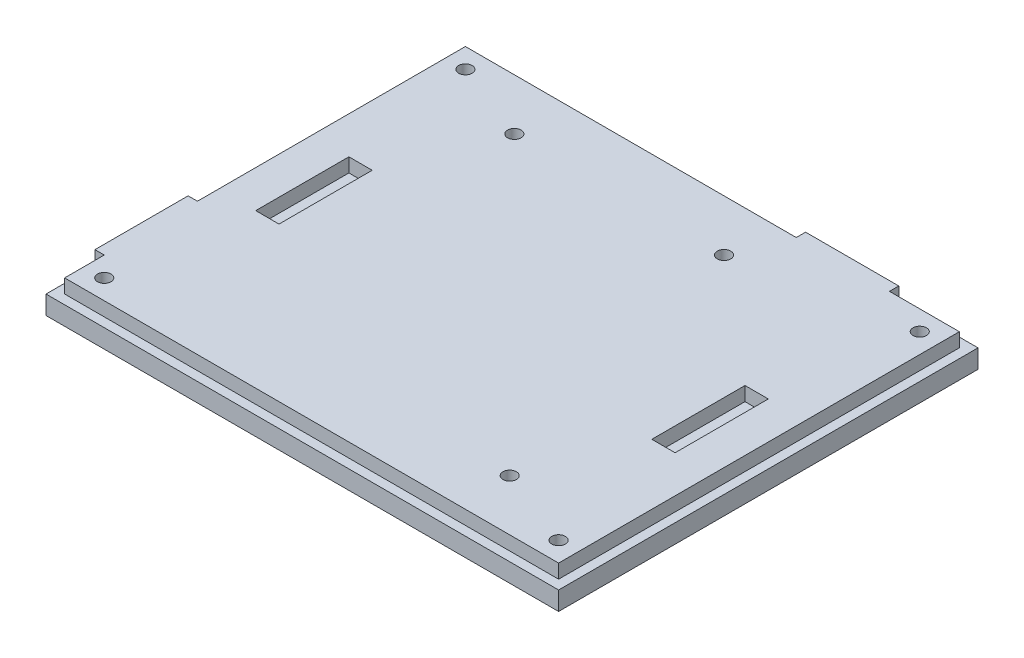
ISO-10303-21;
HEADER;
FILE_DESCRIPTION(('STEP AP214'),'2;1');
FILE_NAME('part.step','',(''),(''),'','','');
FILE_SCHEMA(('AUTOMOTIVE_DESIGN { 1 0 10303 214 1 1 1 1 }'));
ENDSEC;
DATA;
#1=APPLICATION_CONTEXT('core data for automotive mechanical design processes');
#2=APPLICATION_PROTOCOL_DEFINITION('international standard','automotive_design',2000,#1);
#3=PRODUCT_CONTEXT('',#1,'mechanical');
#4=PRODUCT('Part','Part','',(#3));
#5=PRODUCT_RELATED_PRODUCT_CATEGORY('part','',(#4));
#6=PRODUCT_DEFINITION_FORMATION('','',#4);
#7=PRODUCT_DEFINITION_CONTEXT('part definition',#1,'design');
#8=PRODUCT_DEFINITION('design','',#6,#7);
#9=PRODUCT_DEFINITION_SHAPE('','',#8);
#10=(LENGTH_UNIT() NAMED_UNIT(*) SI_UNIT(.MILLI.,.METRE.));
#11=(NAMED_UNIT(*) PLANE_ANGLE_UNIT() SI_UNIT($,.RADIAN.));
#12=(NAMED_UNIT(*) SI_UNIT($,.STERADIAN.) SOLID_ANGLE_UNIT());
#13=UNCERTAINTY_MEASURE_WITH_UNIT(LENGTH_MEASURE(1.E-05),#10,'distance_accuracy_value','');
#14=(GEOMETRIC_REPRESENTATION_CONTEXT(3) GLOBAL_UNCERTAINTY_ASSIGNED_CONTEXT((#13)) GLOBAL_UNIT_ASSIGNED_CONTEXT((#10,
#11,#12)) REPRESENTATION_CONTEXT('',''));
#15=CARTESIAN_POINT('',(0.,0.,0.));
#16=DIRECTION('',(0.,0.,1.));
#17=DIRECTION('',(1.,0.,0.));
#18=AXIS2_PLACEMENT_3D('',#15,#16,#17);
#19=CARTESIAN_POINT('',(-55.,7.,45.));
#20=DIRECTION('',(0.,0.,-1.));
#21=DIRECTION('',(-1.,0.,0.));
#22=AXIS2_PLACEMENT_3D('',#19,#20,#21);
#23=PLANE('',#22);
#24=DIRECTION('',(0.,-1.,0.));
#25=VECTOR('',#24,1.);
#26=CARTESIAN_POINT('',(55.,7.,45.));
#27=LINE('',#26,#25);
#28=CARTESIAN_POINT('',(55.,4.,45.));
#29=VERTEX_POINT('',#28);
#30=CARTESIAN_POINT('',(55.,0.,45.));
#31=VERTEX_POINT('',#30);
#32=EDGE_CURVE('E48',#29,#31,#27,.T.);
#33=ORIENTED_EDGE('',*,*,#32,.F.);
#34=DIRECTION('',(1.,0.,0.));
#35=VECTOR('',#34,1.);
#36=CARTESIAN_POINT('',(-55.,4.,45.));
#37=LINE('',#36,#35);
#38=CARTESIAN_POINT('',(-55.,4.,45.));
#39=VERTEX_POINT('',#38);
#40=EDGE_CURVE('E328',#39,#29,#37,.T.);
#41=ORIENTED_EDGE('',*,*,#40,.F.);
#42=DIRECTION('',(0.,-1.,0.));
#43=VECTOR('',#42,1.);
#44=CARTESIAN_POINT('',(-55.,7.,45.));
#45=LINE('',#44,#43);
#46=CARTESIAN_POINT('',(-55.,0.,45.));
#47=VERTEX_POINT('',#46);
#48=EDGE_CURVE('E11',#39,#47,#45,.T.);
#49=ORIENTED_EDGE('',*,*,#48,.T.);
#50=DIRECTION('',(1.,0.,0.));
#51=VECTOR('',#50,1.);
#52=CARTESIAN_POINT('',(-55.,0.,45.));
#53=LINE('',#52,#51);
#54=EDGE_CURVE('E475',#47,#31,#53,.T.);
#55=ORIENTED_EDGE('',*,*,#54,.T.);
#56=EDGE_LOOP('',(#33,#41,#49,#55));
#57=FACE_BOUND('',#56,.T.);
#58=ADVANCED_FACE('F39',(#57),#23,.F.);
#59=CARTESIAN_POINT('',(-55.,7.,-45.));
#60=DIRECTION('',(1.,0.,0.));
#61=DIRECTION('',(0.,0.,-1.));
#62=AXIS2_PLACEMENT_3D('',#59,#60,#61);
#63=PLANE('',#62);
#64=DIRECTION('',(0.,0.,1.));
#65=VECTOR('',#64,1.);
#66=CARTESIAN_POINT('',(-55.,7.,-45.));
#67=LINE('',#66,#65);
#68=CARTESIAN_POINT('',(-55.,7.,14.5));
#69=VERTEX_POINT('',#68);
#70=CARTESIAN_POINT('',(-55.,7.,34.5));
#71=VERTEX_POINT('',#70);
#72=EDGE_CURVE('E462',#69,#71,#67,.T.);
#73=ORIENTED_EDGE('',*,*,#72,.F.);
#74=DIRECTION('',(0.,1.,0.));
#75=VECTOR('',#74,1.);
#76=CARTESIAN_POINT('',(-55.,4.,14.5));
#77=LINE('',#76,#75);
#78=CARTESIAN_POINT('',(-55.,4.,14.5));
#79=VERTEX_POINT('',#78);
#80=EDGE_CURVE('E63',#79,#69,#77,.T.);
#81=ORIENTED_EDGE('',*,*,#80,.F.);
#82=DIRECTION('',(0.,0.,1.));
#83=VECTOR('',#82,1.);
#84=CARTESIAN_POINT('',(-55.,4.,-45.));
#85=LINE('',#84,#83);
#86=CARTESIAN_POINT('',(-55.,4.,-45.));
#87=VERTEX_POINT('',#86);
#88=EDGE_CURVE('E296',#87,#79,#85,.T.);
#89=ORIENTED_EDGE('',*,*,#88,.F.);
#90=DIRECTION('',(0.,-1.,0.));
#91=VECTOR('',#90,1.);
#92=CARTESIAN_POINT('',(-55.,7.,-45.));
#93=LINE('',#92,#91);
#94=CARTESIAN_POINT('',(-55.,0.,-45.));
#95=VERTEX_POINT('',#94);
#96=EDGE_CURVE('E471',#87,#95,#93,.T.);
#97=ORIENTED_EDGE('',*,*,#96,.T.);
#98=DIRECTION('',(0.,0.,1.));
#99=VECTOR('',#98,1.);
#100=CARTESIAN_POINT('',(-55.,0.,-45.));
#101=LINE('',#100,#99);
#102=EDGE_CURVE('E461',#95,#47,#101,.T.);
#103=ORIENTED_EDGE('',*,*,#102,.T.);
#104=ORIENTED_EDGE('',*,*,#48,.F.);
#105=DIRECTION('',(0.,0.,1.));
#106=VECTOR('',#105,1.);
#107=CARTESIAN_POINT('',(-55.,4.,45.));
#108=LINE('',#107,#106);
#109=CARTESIAN_POINT('',(-55.,4.,34.5));
#110=VERTEX_POINT('',#109);
#111=EDGE_CURVE('E325',#110,#39,#108,.T.);
#112=ORIENTED_EDGE('',*,*,#111,.F.);
#113=DIRECTION('',(0.,1.,0.));
#114=VECTOR('',#113,1.);
#115=CARTESIAN_POINT('',(-55.,4.,34.5));
#116=LINE('',#115,#114);
#117=EDGE_CURVE('E315',#110,#71,#116,.T.);
#118=ORIENTED_EDGE('',*,*,#117,.T.);
#119=EDGE_LOOP('',(#73,#81,#89,#97,#103,#104,#112,#118));
#120=FACE_BOUND('',#119,.T.);
#121=ADVANCED_FACE('F41',(#120),#63,.F.);
#122=CARTESIAN_POINT('',(55.,7.,-45.));
#123=DIRECTION('',(-1.,0.,0.));
#124=DIRECTION('',(0.,0.,1.));
#125=AXIS2_PLACEMENT_3D('',#122,#123,#124);
#126=PLANE('',#125);
#127=DIRECTION('',(0.,0.,-1.));
#128=VECTOR('',#127,1.);
#129=CARTESIAN_POINT('',(55.,4.,-45.));
#130=LINE('',#129,#128);
#131=CARTESIAN_POINT('',(55.,4.,-45.));
#132=VERTEX_POINT('',#131);
#133=EDGE_CURVE('E274',#29,#132,#130,.T.);
#134=ORIENTED_EDGE('',*,*,#133,.F.);
#135=ORIENTED_EDGE('',*,*,#32,.T.);
#136=DIRECTION('',(0.,0.,-1.));
#137=VECTOR('',#136,1.);
#138=CARTESIAN_POINT('',(55.,0.,-45.));
#139=LINE('',#138,#137);
#140=CARTESIAN_POINT('',(55.,0.,-45.));
#141=VERTEX_POINT('',#140);
#142=EDGE_CURVE('E479',#31,#141,#139,.T.);
#143=ORIENTED_EDGE('',*,*,#142,.T.);
#144=DIRECTION('',(0.,-1.,0.));
#145=VECTOR('',#144,1.);
#146=CARTESIAN_POINT('',(55.,7.,-45.));
#147=LINE('',#146,#145);
#148=EDGE_CURVE('E488',#132,#141,#147,.T.);
#149=ORIENTED_EDGE('',*,*,#148,.F.);
#150=EDGE_LOOP('',(#134,#135,#143,#149));
#151=FACE_BOUND('',#150,.T.);
#152=ADVANCED_FACE('F494',(#151),#126,.F.);
#153=CARTESIAN_POINT('',(-55.,7.,-45.));
#154=DIRECTION('',(0.,0.,1.));
#155=DIRECTION('',(1.,0.,0.));
#156=AXIS2_PLACEMENT_3D('',#153,#154,#155);
#157=PLANE('',#156);
#158=DIRECTION('',(-1.,0.,0.));
#159=VECTOR('',#158,1.);
#160=CARTESIAN_POINT('',(-55.,4.,-45.));
#161=LINE('',#160,#159);
#162=CARTESIAN_POINT('',(18.,4.,-45.));
#163=VERTEX_POINT('',#162);
#164=EDGE_CURVE('E309',#163,#87,#161,.T.);
#165=ORIENTED_EDGE('',*,*,#164,.F.);
#166=DIRECTION('',(0.,1.,0.));
#167=VECTOR('',#166,1.);
#168=CARTESIAN_POINT('',(18.,4.,-45.));
#169=LINE('',#168,#167);
#170=CARTESIAN_POINT('',(18.,7.,-45.));
#171=VERTEX_POINT('',#170);
#172=EDGE_CURVE('E264',#163,#171,#169,.T.);
#173=ORIENTED_EDGE('',*,*,#172,.T.);
#174=DIRECTION('',(-1.,0.,0.));
#175=VECTOR('',#174,1.);
#176=CARTESIAN_POINT('',(-55.,7.,-45.));
#177=LINE('',#176,#175);
#178=CARTESIAN_POINT('',(38.,7.,-45.));
#179=VERTEX_POINT('',#178);
#180=EDGE_CURVE('E466',#179,#171,#177,.T.);
#181=ORIENTED_EDGE('',*,*,#180,.F.);
#182=DIRECTION('',(0.,1.,0.));
#183=VECTOR('',#182,1.);
#184=CARTESIAN_POINT('',(38.,4.,-45.));
#185=LINE('',#184,#183);
#186=CARTESIAN_POINT('',(38.,4.,-45.));
#187=VERTEX_POINT('',#186);
#188=EDGE_CURVE('E55',#187,#179,#185,.T.);
#189=ORIENTED_EDGE('',*,*,#188,.F.);
#190=DIRECTION('',(-1.,0.,0.));
#191=VECTOR('',#190,1.);
#192=CARTESIAN_POINT('',(55.,4.,-45.));
#193=LINE('',#192,#191);
#194=EDGE_CURVE('E277',#132,#187,#193,.T.);
#195=ORIENTED_EDGE('',*,*,#194,.F.);
#196=ORIENTED_EDGE('',*,*,#148,.T.);
#197=DIRECTION('',(-1.,0.,0.));
#198=VECTOR('',#197,1.);
#199=CARTESIAN_POINT('',(-55.,0.,-45.));
#200=LINE('',#199,#198);
#201=EDGE_CURVE('E467',#141,#95,#200,.T.);
#202=ORIENTED_EDGE('',*,*,#201,.T.);
#203=ORIENTED_EDGE('',*,*,#96,.F.);
#204=EDGE_LOOP('',(#165,#173,#181,#189,#195,#196,#202,#203));
#205=FACE_BOUND('',#204,.T.);
#206=ADVANCED_FACE('F507',(#205),#157,.F.);
#207=CARTESIAN_POINT('',(0.,7.,0.));
#208=DIRECTION('',(0.,1.,0.));
#209=DIRECTION('',(0.,0.,1.));
#210=AXIS2_PLACEMENT_3D('',#207,#208,#209);
#211=PLANE('',#210);
#212=CARTESIAN_POINT('',(48.75,7.,-38.75));
#213=DIRECTION('',(0.,1.,0.));
#214=DIRECTION('',(0.,0.,1.));
#215=AXIS2_PLACEMENT_3D('',#212,#213,#214);
#216=CIRCLE('',#215,1.44999999999999);
#217=CARTESIAN_POINT('',(48.75,7.,-37.3));
#218=VERTEX_POINT('',#217);
#219=EDGE_CURVE('E685',#218,#218,#216,.T.);
#220=ORIENTED_EDGE('',*,*,#219,.F.);
#221=EDGE_LOOP('',(#220));
#222=FACE_BOUND('',#221,.T.);
#223=CARTESIAN_POINT('',(-48.75,7.,-38.75));
#224=DIRECTION('',(0.,1.,0.));
#225=DIRECTION('',(0.,0.,1.));
#226=AXIS2_PLACEMENT_3D('',#223,#224,#225);
#227=CIRCLE('',#226,1.44999999999999);
#228=CARTESIAN_POINT('',(-48.75,7.,-37.3));
#229=VERTEX_POINT('',#228);
#230=EDGE_CURVE('E689',#229,#229,#227,.T.);
#231=ORIENTED_EDGE('',*,*,#230,.F.);
#232=EDGE_LOOP('',(#231));
#233=FACE_BOUND('',#232,.T.);
#234=CARTESIAN_POINT('',(48.75,7.,38.75));
#235=DIRECTION('',(0.,1.,0.));
#236=DIRECTION('',(0.,0.,1.));
#237=AXIS2_PLACEMENT_3D('',#234,#235,#236);
#238=CIRCLE('',#237,1.44999999999999);
#239=CARTESIAN_POINT('',(48.75,7.,40.2));
#240=VERTEX_POINT('',#239);
#241=EDGE_CURVE('E699',#240,#240,#238,.T.);
#242=ORIENTED_EDGE('',*,*,#241,.F.);
#243=EDGE_LOOP('',(#242));
#244=FACE_BOUND('',#243,.T.);
#245=CARTESIAN_POINT('',(-48.75,7.,38.75));
#246=DIRECTION('',(0.,1.,0.));
#247=DIRECTION('',(0.,0.,1.));
#248=AXIS2_PLACEMENT_3D('',#245,#246,#247);
#249=CIRCLE('',#248,1.44999999999999);
#250=CARTESIAN_POINT('',(-48.75,7.,40.2));
#251=VERTEX_POINT('',#250);
#252=EDGE_CURVE('E537',#251,#251,#249,.T.);
#253=ORIENTED_EDGE('',*,*,#252,.F.);
#254=EDGE_LOOP('',(#253));
#255=FACE_BOUND('',#254,.T.);
#256=DIRECTION('',(-1.,0.,0.));
#257=VECTOR('',#256,1.);
#258=CARTESIAN_POINT('',(53.,7.,43.));
#259=LINE('',#258,#257);
#260=CARTESIAN_POINT('',(53.,7.,43.));
#261=VERTEX_POINT('',#260);
#262=CARTESIAN_POINT('',(-53.,7.,43.));
#263=VERTEX_POINT('',#262);
#264=EDGE_CURVE('E221',#261,#263,#259,.T.);
#265=ORIENTED_EDGE('',*,*,#264,.F.);
#266=DIRECTION('',(0.,0.,1.));
#267=VECTOR('',#266,1.);
#268=CARTESIAN_POINT('',(53.,7.,-43.));
#269=LINE('',#268,#267);
#270=CARTESIAN_POINT('',(53.,7.,-43.));
#271=VERTEX_POINT('',#270);
#272=EDGE_CURVE('E229',#271,#261,#269,.T.);
#273=ORIENTED_EDGE('',*,*,#272,.F.);
#274=DIRECTION('',(1.,0.,0.));
#275=VECTOR('',#274,1.);
#276=CARTESIAN_POINT('',(55.,7.,-43.));
#277=LINE('',#276,#275);
#278=CARTESIAN_POINT('',(38.,7.,-43.));
#279=VERTEX_POINT('',#278);
#280=EDGE_CURVE('E278',#279,#271,#277,.T.);
#281=ORIENTED_EDGE('',*,*,#280,.F.);
#282=DIRECTION('',(0.,0.,1.));
#283=VECTOR('',#282,1.);
#284=CARTESIAN_POINT('',(38.,7.,-45.));
#285=LINE('',#284,#283);
#286=EDGE_CURVE('E242',#179,#279,#285,.T.);
#287=ORIENTED_EDGE('',*,*,#286,.F.);
#288=ORIENTED_EDGE('',*,*,#180,.T.);
#289=DIRECTION('',(0.,0.,-1.));
#290=VECTOR('',#289,1.);
#291=CARTESIAN_POINT('',(18.,7.,-45.));
#292=LINE('',#291,#290);
#293=CARTESIAN_POINT('',(18.,7.,-43.));
#294=VERTEX_POINT('',#293);
#295=EDGE_CURVE('E252',#294,#171,#292,.T.);
#296=ORIENTED_EDGE('',*,*,#295,.F.);
#297=DIRECTION('',(1.,0.,0.));
#298=VECTOR('',#297,1.);
#299=CARTESIAN_POINT('',(-53.,7.,-43.));
#300=LINE('',#299,#298);
#301=CARTESIAN_POINT('',(-53.,7.,-43.));
#302=VERTEX_POINT('',#301);
#303=EDGE_CURVE('E257',#302,#294,#300,.T.);
#304=ORIENTED_EDGE('',*,*,#303,.F.);
#305=DIRECTION('',(0.,0.,-1.));
#306=VECTOR('',#305,1.);
#307=CARTESIAN_POINT('',(-53.,7.,-45.));
#308=LINE('',#307,#306);
#309=CARTESIAN_POINT('',(-53.,7.,14.5));
#310=VERTEX_POINT('',#309);
#311=EDGE_CURVE('E301',#310,#302,#308,.T.);
#312=ORIENTED_EDGE('',*,*,#311,.F.);
#313=DIRECTION('',(1.,0.,0.));
#314=VECTOR('',#313,1.);
#315=CARTESIAN_POINT('',(-55.,7.,14.5));
#316=LINE('',#315,#314);
#317=EDGE_CURVE('E312',#69,#310,#316,.T.);
#318=ORIENTED_EDGE('',*,*,#317,.F.);
#319=ORIENTED_EDGE('',*,*,#72,.T.);
#320=DIRECTION('',(-1.,0.,0.));
#321=VECTOR('',#320,1.);
#322=CARTESIAN_POINT('',(-55.,7.,34.5));
#323=LINE('',#322,#321);
#324=CARTESIAN_POINT('',(-53.,7.,34.5));
#325=VERTEX_POINT('',#324);
#326=EDGE_CURVE('E329',#325,#71,#323,.T.);
#327=ORIENTED_EDGE('',*,*,#326,.F.);
#328=DIRECTION('',(0.,0.,-1.));
#329=VECTOR('',#328,1.);
#330=CARTESIAN_POINT('',(-53.,7.,45.));
#331=LINE('',#330,#329);
#332=EDGE_CURVE('E268',#263,#325,#331,.T.);
#333=ORIENTED_EDGE('',*,*,#332,.F.);
#334=EDGE_LOOP('',(#265,#273,#281,#287,#288,#296,#304,#312,#318,#319,#327,#333));
#335=FACE_BOUND('',#334,.T.);
#336=DIRECTION('',(0.,0.,1.));
#337=VECTOR('',#336,1.);
#338=CARTESIAN_POINT('',(-45.,7.,-10.));
#339=LINE('',#338,#337);
#340=CARTESIAN_POINT('',(-45.,7.,-10.));
#341=VERTEX_POINT('',#340);
#342=CARTESIAN_POINT('',(-45.,7.,10.));
#343=VERTEX_POINT('',#342);
#344=EDGE_CURVE('E368',#341,#343,#339,.T.);
#345=ORIENTED_EDGE('',*,*,#344,.F.);
#346=DIRECTION('',(-1.,0.,0.));
#347=VECTOR('',#346,1.);
#348=CARTESIAN_POINT('',(-45.,7.,-10.));
#349=LINE('',#348,#347);
#350=CARTESIAN_POINT('',(-40.,7.,-10.));
#351=VERTEX_POINT('',#350);
#352=EDGE_CURVE('E355',#351,#341,#349,.T.);
#353=ORIENTED_EDGE('',*,*,#352,.F.);
#354=DIRECTION('',(0.,0.,-1.));
#355=VECTOR('',#354,1.);
#356=CARTESIAN_POINT('',(-40.,7.,-10.));
#357=LINE('',#356,#355);
#358=CARTESIAN_POINT('',(-40.,7.,10.));
#359=VERTEX_POINT('',#358);
#360=EDGE_CURVE('E376',#359,#351,#357,.T.);
#361=ORIENTED_EDGE('',*,*,#360,.F.);
#362=DIRECTION('',(1.,0.,0.));
#363=VECTOR('',#362,1.);
#364=CARTESIAN_POINT('',(-45.,7.,10.));
#365=LINE('',#364,#363);
#366=EDGE_CURVE('E371',#343,#359,#365,.T.);
#367=ORIENTED_EDGE('',*,*,#366,.F.);
#368=EDGE_LOOP('',(#345,#353,#361,#367));
#369=FACE_BOUND('',#368,.T.);
#370=DIRECTION('',(0.,0.,-1.));
#371=VECTOR('',#370,1.);
#372=CARTESIAN_POINT('',(45.,7.,-10.));
#373=LINE('',#372,#371);
#374=CARTESIAN_POINT('',(45.,7.,10.));
#375=VERTEX_POINT('',#374);
#376=CARTESIAN_POINT('',(45.,7.,-10.));
#377=VERTEX_POINT('',#376);
#378=EDGE_CURVE('E322',#375,#377,#373,.T.);
#379=ORIENTED_EDGE('',*,*,#378,.F.);
#380=DIRECTION('',(1.,0.,0.));
#381=VECTOR('',#380,1.);
#382=CARTESIAN_POINT('',(45.,7.,10.));
#383=LINE('',#382,#381);
#384=CARTESIAN_POINT('',(40.,7.,10.));
#385=VERTEX_POINT('',#384);
#386=EDGE_CURVE('E401',#385,#375,#383,.T.);
#387=ORIENTED_EDGE('',*,*,#386,.F.);
#388=DIRECTION('',(0.,0.,1.));
#389=VECTOR('',#388,1.);
#390=CARTESIAN_POINT('',(40.,7.,-10.));
#391=LINE('',#390,#389);
#392=CARTESIAN_POINT('',(40.,7.,-10.));
#393=VERTEX_POINT('',#392);
#394=EDGE_CURVE('E420',#393,#385,#391,.T.);
#395=ORIENTED_EDGE('',*,*,#394,.F.);
#396=DIRECTION('',(-1.,0.,0.));
#397=VECTOR('',#396,1.);
#398=CARTESIAN_POINT('',(45.,7.,-10.));
#399=LINE('',#398,#397);
#400=EDGE_CURVE('E416',#377,#393,#399,.T.);
#401=ORIENTED_EDGE('',*,*,#400,.F.);
#402=EDGE_LOOP('',(#379,#387,#395,#401));
#403=FACE_BOUND('',#402,.T.);
#404=CARTESIAN_POINT('',(-31.5,7.,-32.));
#405=DIRECTION('',(0.,1.,0.));
#406=DIRECTION('',(0.,0.,1.));
#407=AXIS2_PLACEMENT_3D('',#404,#405,#406);
#408=CIRCLE('',#407,1.44999999999999);
#409=CARTESIAN_POINT('',(-31.5,7.,-30.55));
#410=VERTEX_POINT('',#409);
#411=EDGE_CURVE('E386',#410,#410,#408,.T.);
#412=ORIENTED_EDGE('',*,*,#411,.F.);
#413=EDGE_LOOP('',(#412));
#414=FACE_BOUND('',#413,.T.);
#415=CARTESIAN_POINT('',(13.5,7.,-32.));
#416=DIRECTION('',(0.,1.,0.));
#417=DIRECTION('',(0.,0.,1.));
#418=AXIS2_PLACEMENT_3D('',#415,#416,#417);
#419=CIRCLE('',#418,1.44999999999999);
#420=CARTESIAN_POINT('',(13.5,7.,-30.55));
#421=VERTEX_POINT('',#420);
#422=EDGE_CURVE('E445',#421,#421,#419,.T.);
#423=ORIENTED_EDGE('',*,*,#422,.F.);
#424=EDGE_LOOP('',(#423));
#425=FACE_BOUND('',#424,.T.);
#426=CARTESIAN_POINT('',(31.5,7.,32.));
#427=DIRECTION('',(0.,1.,0.));
#428=DIRECTION('',(0.,0.,1.));
#429=AXIS2_PLACEMENT_3D('',#426,#427,#428);
#430=CIRCLE('',#429,1.44999999999999);
#431=CARTESIAN_POINT('',(31.5,7.,33.45));
#432=VERTEX_POINT('',#431);
#433=EDGE_CURVE('E453',#432,#432,#430,.T.);
#434=ORIENTED_EDGE('',*,*,#433,.F.);
#435=EDGE_LOOP('',(#434));
#436=FACE_BOUND('',#435,.T.);
#437=ADVANCED_FACE('F523',(#222,#233,#244,#255,#335,#369,#403,#414,#425,#436),#211,.T.);
#438=CARTESIAN_POINT('',(0.,0.,0.));
#439=DIRECTION('',(0.,1.,0.));
#440=DIRECTION('',(0.,0.,1.));
#441=AXIS2_PLACEMENT_3D('',#438,#439,#440);
#442=PLANE('',#441);
#443=CARTESIAN_POINT('',(48.75,0.,-38.75));
#444=DIRECTION('',(0.,1.,0.));
#445=DIRECTION('',(0.,0.,1.));
#446=AXIS2_PLACEMENT_3D('',#443,#444,#445);
#447=CIRCLE('',#446,1.45);
#448=CARTESIAN_POINT('',(48.75,0.,-37.3));
#449=VERTEX_POINT('',#448);
#450=EDGE_CURVE('E682',#449,#449,#447,.T.);
#451=ORIENTED_EDGE('',*,*,#450,.T.);
#452=EDGE_LOOP('',(#451));
#453=FACE_BOUND('',#452,.T.);
#454=CARTESIAN_POINT('',(-48.75,0.,-38.75));
#455=DIRECTION('',(0.,1.,0.));
#456=DIRECTION('',(0.,0.,1.));
#457=AXIS2_PLACEMENT_3D('',#454,#455,#456);
#458=CIRCLE('',#457,1.45);
#459=CARTESIAN_POINT('',(-48.75,0.,-37.3));
#460=VERTEX_POINT('',#459);
#461=EDGE_CURVE('E695',#460,#460,#458,.T.);
#462=ORIENTED_EDGE('',*,*,#461,.T.);
#463=EDGE_LOOP('',(#462));
#464=FACE_BOUND('',#463,.T.);
#465=CARTESIAN_POINT('',(48.75,0.,38.75));
#466=DIRECTION('',(0.,1.,0.));
#467=DIRECTION('',(0.,0.,1.));
#468=AXIS2_PLACEMENT_3D('',#465,#466,#467);
#469=CIRCLE('',#468,1.45);
#470=CARTESIAN_POINT('',(48.75,0.,40.2));
#471=VERTEX_POINT('',#470);
#472=EDGE_CURVE('E703',#471,#471,#469,.T.);
#473=ORIENTED_EDGE('',*,*,#472,.T.);
#474=EDGE_LOOP('',(#473));
#475=FACE_BOUND('',#474,.T.);
#476=CARTESIAN_POINT('',(-48.75,0.,38.75));
#477=DIRECTION('',(0.,1.,0.));
#478=DIRECTION('',(0.,0.,1.));
#479=AXIS2_PLACEMENT_3D('',#476,#477,#478);
#480=CIRCLE('',#479,1.45);
#481=CARTESIAN_POINT('',(-48.75,0.,40.2));
#482=VERTEX_POINT('',#481);
#483=EDGE_CURVE('E533',#482,#482,#480,.T.);
#484=ORIENTED_EDGE('',*,*,#483,.T.);
#485=EDGE_LOOP('',(#484));
#486=FACE_BOUND('',#485,.T.);
#487=ORIENTED_EDGE('',*,*,#102,.F.);
#488=ORIENTED_EDGE('',*,*,#201,.F.);
#489=ORIENTED_EDGE('',*,*,#142,.F.);
#490=ORIENTED_EDGE('',*,*,#54,.F.);
#491=EDGE_LOOP('',(#487,#488,#489,#490));
#492=FACE_BOUND('',#491,.T.);
#493=ADVANCED_FACE('F504',(#453,#464,#475,#486,#492),#442,.F.);
#494=CARTESIAN_POINT('',(31.5,2.,32.));
#495=DIRECTION('',(0.,1.,0.));
#496=DIRECTION('',(0.,0.,1.));
#497=AXIS2_PLACEMENT_3D('',#494,#495,#496);
#498=CONICAL_SURFACE('',#497,1.44999999999999,1.02974425867665);
#499=CARTESIAN_POINT('',(31.5,1.12875210241004,32.));
#500=VERTEX_POINT('',#499);
#501=VERTEX_LOOP('',#500);
#502=FACE_BOUND('',#501,.T.);
#503=CARTESIAN_POINT('',(31.5,2.,32.));
#504=DIRECTION('',(0.,1.,0.));
#505=DIRECTION('',(0.,0.,1.));
#506=AXIS2_PLACEMENT_3D('',#503,#504,#505);
#507=CIRCLE('',#506,1.44999999999999);
#508=CARTESIAN_POINT('',(31.5,2.,33.45));
#509=VERTEX_POINT('',#508);
#510=EDGE_CURVE('E457',#509,#509,#507,.T.);
#511=ORIENTED_EDGE('',*,*,#510,.T.);
#512=EDGE_LOOP('',(#511));
#513=FACE_BOUND('',#512,.T.);
#514=ADVANCED_FACE('F572',(#502,#513),#498,.F.);
#515=CARTESIAN_POINT('',(31.5,7.,32.));
#516=DIRECTION('',(0.,1.,0.));
#517=DIRECTION('',(0.,0.,1.));
#518=AXIS2_PLACEMENT_3D('',#515,#516,#517);
#519=CYLINDRICAL_SURFACE('',#518,1.44999999999999);
#520=ORIENTED_EDGE('',*,*,#510,.F.);
#521=EDGE_LOOP('',(#520));
#522=FACE_BOUND('',#521,.T.);
#523=ORIENTED_EDGE('',*,*,#433,.T.);
#524=EDGE_LOOP('',(#523));
#525=FACE_BOUND('',#524,.T.);
#526=ADVANCED_FACE('F579',(#522,#525),#519,.F.);
#527=CARTESIAN_POINT('',(13.5,2.,-32.));
#528=DIRECTION('',(0.,1.,0.));
#529=DIRECTION('',(0.,0.,1.));
#530=AXIS2_PLACEMENT_3D('',#527,#528,#529);
#531=CONICAL_SURFACE('',#530,1.44999999999999,1.02974425867665);
#532=CARTESIAN_POINT('',(13.5,1.12875210241004,-32.));
#533=VERTEX_POINT('',#532);
#534=VERTEX_LOOP('',#533);
#535=FACE_BOUND('',#534,.T.);
#536=CARTESIAN_POINT('',(13.5,2.,-32.));
#537=DIRECTION('',(0.,1.,0.));
#538=DIRECTION('',(0.,0.,1.));
#539=AXIS2_PLACEMENT_3D('',#536,#537,#538);
#540=CIRCLE('',#539,1.44999999999999);
#541=CARTESIAN_POINT('',(13.5,2.,-30.55));
#542=VERTEX_POINT('',#541);
#543=EDGE_CURVE('E449',#542,#542,#540,.T.);
#544=ORIENTED_EDGE('',*,*,#543,.T.);
#545=EDGE_LOOP('',(#544));
#546=FACE_BOUND('',#545,.T.);
#547=ADVANCED_FACE('F583',(#535,#546),#531,.F.);
#548=CARTESIAN_POINT('',(13.5,7.,-32.));
#549=DIRECTION('',(0.,1.,0.));
#550=DIRECTION('',(0.,0.,1.));
#551=AXIS2_PLACEMENT_3D('',#548,#549,#550);
#552=CYLINDRICAL_SURFACE('',#551,1.44999999999999);
#553=ORIENTED_EDGE('',*,*,#543,.F.);
#554=EDGE_LOOP('',(#553));
#555=FACE_BOUND('',#554,.T.);
#556=ORIENTED_EDGE('',*,*,#422,.T.);
#557=EDGE_LOOP('',(#556));
#558=FACE_BOUND('',#557,.T.);
#559=ADVANCED_FACE('F587',(#555,#558),#552,.F.);
#560=CARTESIAN_POINT('',(-31.5,2.,-32.));
#561=DIRECTION('',(0.,1.,0.));
#562=DIRECTION('',(0.,0.,1.));
#563=AXIS2_PLACEMENT_3D('',#560,#561,#562);
#564=CONICAL_SURFACE('',#563,1.44999999999999,1.02974425867665);
#565=CARTESIAN_POINT('',(-31.5,1.12875210241004,-32.));
#566=VERTEX_POINT('',#565);
#567=VERTEX_LOOP('',#566);
#568=FACE_BOUND('',#567,.T.);
#569=CARTESIAN_POINT('',(-31.5,2.,-32.));
#570=DIRECTION('',(0.,1.,0.));
#571=DIRECTION('',(0.,0.,1.));
#572=AXIS2_PLACEMENT_3D('',#569,#570,#571);
#573=CIRCLE('',#572,1.44999999999999);
#574=CARTESIAN_POINT('',(-31.5,2.,-30.55));
#575=VERTEX_POINT('',#574);
#576=EDGE_CURVE('E441',#575,#575,#573,.T.);
#577=ORIENTED_EDGE('',*,*,#576,.T.);
#578=EDGE_LOOP('',(#577));
#579=FACE_BOUND('',#578,.T.);
#580=ADVANCED_FACE('F591',(#568,#579),#564,.F.);
#581=CARTESIAN_POINT('',(-31.5,7.,-32.));
#582=DIRECTION('',(0.,1.,0.));
#583=DIRECTION('',(0.,0.,1.));
#584=AXIS2_PLACEMENT_3D('',#581,#582,#583);
#585=CYLINDRICAL_SURFACE('',#584,1.44999999999999);
#586=ORIENTED_EDGE('',*,*,#576,.F.);
#587=EDGE_LOOP('',(#586));
#588=FACE_BOUND('',#587,.T.);
#589=ORIENTED_EDGE('',*,*,#411,.T.);
#590=EDGE_LOOP('',(#589));
#591=FACE_BOUND('',#590,.T.);
#592=ADVANCED_FACE('F595',(#588,#591),#585,.F.);
#593=CARTESIAN_POINT('',(45.,4.,-10.));
#594=DIRECTION('',(1.,0.,0.));
#595=DIRECTION('',(0.,0.,-1.));
#596=AXIS2_PLACEMENT_3D('',#593,#594,#595);
#597=PLANE('',#596);
#598=ORIENTED_EDGE('',*,*,#378,.T.);
#599=DIRECTION('',(0.,1.,0.));
#600=VECTOR('',#599,1.);
#601=CARTESIAN_POINT('',(45.,4.,-10.));
#602=LINE('',#601,#600);
#603=CARTESIAN_POINT('',(45.,4.,-10.));
#604=VERTEX_POINT('',#603);
#605=EDGE_CURVE('E413',#604,#377,#602,.T.);
#606=ORIENTED_EDGE('',*,*,#605,.F.);
#607=DIRECTION('',(0.,0.,-1.));
#608=VECTOR('',#607,1.);
#609=CARTESIAN_POINT('',(45.,4.,-10.));
#610=LINE('',#609,#608);
#611=CARTESIAN_POINT('',(45.,4.,10.));
#612=VERTEX_POINT('',#611);
#613=EDGE_CURVE('E396',#612,#604,#610,.T.);
#614=ORIENTED_EDGE('',*,*,#613,.F.);
#615=DIRECTION('',(0.,1.,0.));
#616=VECTOR('',#615,1.);
#617=CARTESIAN_POINT('',(45.,4.,10.));
#618=LINE('',#617,#616);
#619=EDGE_CURVE('E372',#612,#375,#618,.T.);
#620=ORIENTED_EDGE('',*,*,#619,.T.);
#621=EDGE_LOOP('',(#598,#606,#614,#620));
#622=FACE_BOUND('',#621,.T.);
#623=ADVANCED_FACE('F599',(#622),#597,.F.);
#624=CARTESIAN_POINT('',(45.,4.,10.));
#625=DIRECTION('',(0.,0.,1.));
#626=DIRECTION('',(1.,0.,0.));
#627=AXIS2_PLACEMENT_3D('',#624,#625,#626);
#628=PLANE('',#627);
#629=ORIENTED_EDGE('',*,*,#386,.T.);
#630=ORIENTED_EDGE('',*,*,#619,.F.);
#631=DIRECTION('',(1.,0.,0.));
#632=VECTOR('',#631,1.);
#633=CARTESIAN_POINT('',(45.,4.,10.));
#634=LINE('',#633,#632);
#635=CARTESIAN_POINT('',(40.,4.,10.));
#636=VERTEX_POINT('',#635);
#637=EDGE_CURVE('E409',#636,#612,#634,.T.);
#638=ORIENTED_EDGE('',*,*,#637,.F.);
#639=DIRECTION('',(0.,1.,0.));
#640=VECTOR('',#639,1.);
#641=CARTESIAN_POINT('',(40.,4.,10.));
#642=LINE('',#641,#640);
#643=EDGE_CURVE('E429',#636,#385,#642,.T.);
#644=ORIENTED_EDGE('',*,*,#643,.T.);
#645=EDGE_LOOP('',(#629,#630,#638,#644));
#646=FACE_BOUND('',#645,.T.);
#647=ADVANCED_FACE('F603',(#646),#628,.F.);
#648=CARTESIAN_POINT('',(40.,4.,-10.));
#649=DIRECTION('',(-1.,0.,0.));
#650=DIRECTION('',(0.,0.,1.));
#651=AXIS2_PLACEMENT_3D('',#648,#649,#650);
#652=PLANE('',#651);
#653=ORIENTED_EDGE('',*,*,#394,.T.);
#654=ORIENTED_EDGE('',*,*,#643,.F.);
#655=DIRECTION('',(0.,0.,1.));
#656=VECTOR('',#655,1.);
#657=CARTESIAN_POINT('',(40.,4.,-10.));
#658=LINE('',#657,#656);
#659=CARTESIAN_POINT('',(40.,4.,-10.));
#660=VERTEX_POINT('',#659);
#661=EDGE_CURVE('E405',#660,#636,#658,.T.);
#662=ORIENTED_EDGE('',*,*,#661,.F.);
#663=DIRECTION('',(0.,1.,0.));
#664=VECTOR('',#663,1.);
#665=CARTESIAN_POINT('',(40.,4.,-10.));
#666=LINE('',#665,#664);
#667=EDGE_CURVE('E432',#660,#393,#666,.T.);
#668=ORIENTED_EDGE('',*,*,#667,.T.);
#669=EDGE_LOOP('',(#653,#654,#662,#668));
#670=FACE_BOUND('',#669,.T.);
#671=ADVANCED_FACE('F609',(#670),#652,.F.);
#672=CARTESIAN_POINT('',(45.,4.,-10.));
#673=DIRECTION('',(0.,0.,-1.));
#674=DIRECTION('',(-1.,0.,0.));
#675=AXIS2_PLACEMENT_3D('',#672,#673,#674);
#676=PLANE('',#675);
#677=ORIENTED_EDGE('',*,*,#400,.T.);
#678=ORIENTED_EDGE('',*,*,#667,.F.);
#679=DIRECTION('',(-1.,0.,0.));
#680=VECTOR('',#679,1.);
#681=CARTESIAN_POINT('',(45.,4.,-10.));
#682=LINE('',#681,#680);
#683=EDGE_CURVE('E400',#604,#660,#682,.T.);
#684=ORIENTED_EDGE('',*,*,#683,.F.);
#685=ORIENTED_EDGE('',*,*,#605,.T.);
#686=EDGE_LOOP('',(#677,#678,#684,#685));
#687=FACE_BOUND('',#686,.T.);
#688=ADVANCED_FACE('F605',(#687),#676,.F.);
#689=CARTESIAN_POINT('',(0.,4.,0.));
#690=DIRECTION('',(0.,-1.,0.));
#691=DIRECTION('',(0.,0.,-1.));
#692=AXIS2_PLACEMENT_3D('',#689,#690,#691);
#693=PLANE('',#692);
#694=ORIENTED_EDGE('',*,*,#613,.T.);
#695=ORIENTED_EDGE('',*,*,#683,.T.);
#696=ORIENTED_EDGE('',*,*,#661,.T.);
#697=ORIENTED_EDGE('',*,*,#637,.T.);
#698=EDGE_LOOP('',(#694,#695,#696,#697));
#699=FACE_BOUND('',#698,.T.);
#700=ADVANCED_FACE('F608',(#699),#693,.F.);
#701=CARTESIAN_POINT('',(-45.,4.,-10.));
#702=DIRECTION('',(-1.,0.,0.));
#703=DIRECTION('',(0.,0.,1.));
#704=AXIS2_PLACEMENT_3D('',#701,#702,#703);
#705=PLANE('',#704);
#706=ORIENTED_EDGE('',*,*,#344,.T.);
#707=DIRECTION('',(0.,1.,0.));
#708=VECTOR('',#707,1.);
#709=CARTESIAN_POINT('',(-45.,4.,10.));
#710=LINE('',#709,#708);
#711=CARTESIAN_POINT('',(-45.,4.,10.));
#712=VERTEX_POINT('',#711);
#713=EDGE_CURVE('E367',#712,#343,#710,.T.);
#714=ORIENTED_EDGE('',*,*,#713,.F.);
#715=DIRECTION('',(0.,0.,1.));
#716=VECTOR('',#715,1.);
#717=CARTESIAN_POINT('',(-45.,4.,-10.));
#718=LINE('',#717,#716);
#719=CARTESIAN_POINT('',(-45.,4.,-10.));
#720=VERTEX_POINT('',#719);
#721=EDGE_CURVE('E350',#720,#712,#718,.T.);
#722=ORIENTED_EDGE('',*,*,#721,.F.);
#723=DIRECTION('',(0.,1.,0.));
#724=VECTOR('',#723,1.);
#725=CARTESIAN_POINT('',(-45.,4.,-10.));
#726=LINE('',#725,#724);
#727=EDGE_CURVE('E383',#720,#341,#726,.T.);
#728=ORIENTED_EDGE('',*,*,#727,.T.);
#729=EDGE_LOOP('',(#706,#714,#722,#728));
#730=FACE_BOUND('',#729,.T.);
#731=ADVANCED_FACE('F619',(#730),#705,.F.);
#732=CARTESIAN_POINT('',(-45.,4.,-10.));
#733=DIRECTION('',(0.,0.,-1.));
#734=DIRECTION('',(-1.,0.,0.));
#735=AXIS2_PLACEMENT_3D('',#732,#733,#734);
#736=PLANE('',#735);
#737=ORIENTED_EDGE('',*,*,#352,.T.);
#738=ORIENTED_EDGE('',*,*,#727,.F.);
#739=DIRECTION('',(-1.,0.,0.));
#740=VECTOR('',#739,1.);
#741=CARTESIAN_POINT('',(-45.,4.,-10.));
#742=LINE('',#741,#740);
#743=CARTESIAN_POINT('',(-40.,4.,-10.));
#744=VERTEX_POINT('',#743);
#745=EDGE_CURVE('E363',#744,#720,#742,.T.);
#746=ORIENTED_EDGE('',*,*,#745,.F.);
#747=DIRECTION('',(0.,1.,0.));
#748=VECTOR('',#747,1.);
#749=CARTESIAN_POINT('',(-40.,4.,-10.));
#750=LINE('',#749,#748);
#751=EDGE_CURVE('E387',#744,#351,#750,.T.);
#752=ORIENTED_EDGE('',*,*,#751,.T.);
#753=EDGE_LOOP('',(#737,#738,#746,#752));
#754=FACE_BOUND('',#753,.T.);
#755=ADVANCED_FACE('F623',(#754),#736,.F.);
#756=CARTESIAN_POINT('',(-40.,4.,-10.));
#757=DIRECTION('',(1.,0.,0.));
#758=DIRECTION('',(0.,0.,-1.));
#759=AXIS2_PLACEMENT_3D('',#756,#757,#758);
#760=PLANE('',#759);
#761=ORIENTED_EDGE('',*,*,#360,.T.);
#762=ORIENTED_EDGE('',*,*,#751,.F.);
#763=DIRECTION('',(0.,0.,-1.));
#764=VECTOR('',#763,1.);
#765=CARTESIAN_POINT('',(-40.,4.,-10.));
#766=LINE('',#765,#764);
#767=CARTESIAN_POINT('',(-40.,4.,10.));
#768=VERTEX_POINT('',#767);
#769=EDGE_CURVE('E359',#768,#744,#766,.T.);
#770=ORIENTED_EDGE('',*,*,#769,.F.);
#771=DIRECTION('',(0.,1.,0.));
#772=VECTOR('',#771,1.);
#773=CARTESIAN_POINT('',(-40.,4.,10.));
#774=LINE('',#773,#772);
#775=EDGE_CURVE('E390',#768,#359,#774,.T.);
#776=ORIENTED_EDGE('',*,*,#775,.T.);
#777=EDGE_LOOP('',(#761,#762,#770,#776));
#778=FACE_BOUND('',#777,.T.);
#779=ADVANCED_FACE('F629',(#778),#760,.F.);
#780=CARTESIAN_POINT('',(-45.,4.,10.));
#781=DIRECTION('',(0.,0.,1.));
#782=DIRECTION('',(1.,0.,0.));
#783=AXIS2_PLACEMENT_3D('',#780,#781,#782);
#784=PLANE('',#783);
#785=ORIENTED_EDGE('',*,*,#366,.T.);
#786=ORIENTED_EDGE('',*,*,#775,.F.);
#787=DIRECTION('',(1.,0.,0.));
#788=VECTOR('',#787,1.);
#789=CARTESIAN_POINT('',(-45.,4.,10.));
#790=LINE('',#789,#788);
#791=EDGE_CURVE('E354',#712,#768,#790,.T.);
#792=ORIENTED_EDGE('',*,*,#791,.F.);
#793=ORIENTED_EDGE('',*,*,#713,.T.);
#794=EDGE_LOOP('',(#785,#786,#792,#793));
#795=FACE_BOUND('',#794,.T.);
#796=ADVANCED_FACE('F625',(#795),#784,.F.);
#797=CARTESIAN_POINT('',(0.,4.,0.));
#798=DIRECTION('',(0.,1.,0.));
#799=DIRECTION('',(0.,0.,1.));
#800=AXIS2_PLACEMENT_3D('',#797,#798,#799);
#801=PLANE('',#800);
#802=ORIENTED_EDGE('',*,*,#721,.T.);
#803=ORIENTED_EDGE('',*,*,#791,.T.);
#804=ORIENTED_EDGE('',*,*,#769,.T.);
#805=ORIENTED_EDGE('',*,*,#745,.T.);
#806=EDGE_LOOP('',(#802,#803,#804,#805));
#807=FACE_BOUND('',#806,.T.);
#808=ADVANCED_FACE('F628',(#807),#801,.T.);
#809=CARTESIAN_POINT('',(-55.,4.,34.5));
#810=DIRECTION('',(0.,0.,-1.));
#811=DIRECTION('',(-1.,0.,0.));
#812=AXIS2_PLACEMENT_3D('',#809,#810,#811);
#813=PLANE('',#812);
#814=ORIENTED_EDGE('',*,*,#326,.T.);
#815=ORIENTED_EDGE('',*,*,#117,.F.);
#816=DIRECTION('',(-1.,0.,0.));
#817=VECTOR('',#816,1.);
#818=CARTESIAN_POINT('',(-55.,4.,34.5));
#819=LINE('',#818,#817);
#820=CARTESIAN_POINT('',(-53.,4.,34.5));
#821=VERTEX_POINT('',#820);
#822=EDGE_CURVE('E335',#821,#110,#819,.T.);
#823=ORIENTED_EDGE('',*,*,#822,.F.);
#824=DIRECTION('',(0.,1.,0.));
#825=VECTOR('',#824,1.);
#826=CARTESIAN_POINT('',(-53.,4.,34.5));
#827=LINE('',#826,#825);
#828=EDGE_CURVE('E339',#821,#325,#827,.T.);
#829=ORIENTED_EDGE('',*,*,#828,.T.);
#830=EDGE_LOOP('',(#814,#815,#823,#829));
#831=FACE_BOUND('',#830,.T.);
#832=ADVANCED_FACE('F545',(#831),#813,.F.);
#833=CARTESIAN_POINT('',(-53.,4.,45.));
#834=DIRECTION('',(1.,0.,0.));
#835=DIRECTION('',(0.,0.,-1.));
#836=AXIS2_PLACEMENT_3D('',#833,#834,#835);
#837=PLANE('',#836);
#838=DIRECTION('',(0.,0.,-1.));
#839=VECTOR('',#838,1.);
#840=CARTESIAN_POINT('',(-53.,4.,45.));
#841=LINE('',#840,#839);
#842=CARTESIAN_POINT('',(-53.,4.,43.));
#843=VERTEX_POINT('',#842);
#844=EDGE_CURVE('E332',#843,#821,#841,.T.);
#845=ORIENTED_EDGE('',*,*,#844,.F.);
#846=DIRECTION('',(0.,1.,0.));
#847=VECTOR('',#846,1.);
#848=CARTESIAN_POINT('',(-53.,4.,43.));
#849=LINE('',#848,#847);
#850=EDGE_CURVE('E216',#843,#263,#849,.T.);
#851=ORIENTED_EDGE('',*,*,#850,.T.);
#852=ORIENTED_EDGE('',*,*,#332,.T.);
#853=ORIENTED_EDGE('',*,*,#828,.F.);
#854=EDGE_LOOP('',(#845,#851,#852,#853));
#855=FACE_BOUND('',#854,.T.);
#856=ADVANCED_FACE('F541',(#855),#837,.F.);
#857=CARTESIAN_POINT('',(0.,4.,0.));
#858=DIRECTION('',(0.,-1.,0.));
#859=DIRECTION('',(0.,0.,-1.));
#860=AXIS2_PLACEMENT_3D('',#857,#858,#859);
#861=PLANE('',#860);
#862=ORIENTED_EDGE('',*,*,#111,.T.);
#863=ORIENTED_EDGE('',*,*,#40,.T.);
#864=ORIENTED_EDGE('',*,*,#133,.T.);
#865=ORIENTED_EDGE('',*,*,#194,.T.);
#866=DIRECTION('',(0.,0.,1.));
#867=VECTOR('',#866,1.);
#868=CARTESIAN_POINT('',(38.,4.,-45.));
#869=LINE('',#868,#867);
#870=CARTESIAN_POINT('',(38.,4.,-43.));
#871=VERTEX_POINT('',#870);
#872=EDGE_CURVE('E282',#187,#871,#869,.T.);
#873=ORIENTED_EDGE('',*,*,#872,.T.);
#874=DIRECTION('',(1.,0.,0.));
#875=VECTOR('',#874,1.);
#876=CARTESIAN_POINT('',(55.,4.,-43.));
#877=LINE('',#876,#875);
#878=CARTESIAN_POINT('',(53.,4.,-43.));
#879=VERTEX_POINT('',#878);
#880=EDGE_CURVE('E236',#871,#879,#877,.T.);
#881=ORIENTED_EDGE('',*,*,#880,.T.);
#882=DIRECTION('',(0.,0.,1.));
#883=VECTOR('',#882,1.);
#884=CARTESIAN_POINT('',(53.,4.,-43.));
#885=LINE('',#884,#883);
#886=CARTESIAN_POINT('',(53.,4.,43.));
#887=VERTEX_POINT('',#886);
#888=EDGE_CURVE('E226',#879,#887,#885,.T.);
#889=ORIENTED_EDGE('',*,*,#888,.T.);
#890=DIRECTION('',(-1.,0.,0.));
#891=VECTOR('',#890,1.);
#892=CARTESIAN_POINT('',(53.,4.,43.));
#893=LINE('',#892,#891);
#894=EDGE_CURVE('E210',#887,#843,#893,.T.);
#895=ORIENTED_EDGE('',*,*,#894,.T.);
#896=ORIENTED_EDGE('',*,*,#844,.T.);
#897=ORIENTED_EDGE('',*,*,#822,.T.);
#898=EDGE_LOOP('',(#862,#863,#864,#865,#873,#881,#889,#895,#896,#897));
#899=FACE_BOUND('',#898,.T.);
#900=ADVANCED_FACE('F233',(#899),#861,.F.);
#901=CARTESIAN_POINT('',(-53.,4.,-45.));
#902=DIRECTION('',(1.,0.,0.));
#903=DIRECTION('',(0.,0.,-1.));
#904=AXIS2_PLACEMENT_3D('',#901,#902,#903);
#905=PLANE('',#904);
#906=ORIENTED_EDGE('',*,*,#311,.T.);
#907=DIRECTION('',(0.,1.,0.));
#908=VECTOR('',#907,1.);
#909=CARTESIAN_POINT('',(-53.,4.,-43.));
#910=LINE('',#909,#908);
#911=CARTESIAN_POINT('',(-53.,4.,-43.));
#912=VERTEX_POINT('',#911);
#913=EDGE_CURVE('E256',#912,#302,#910,.T.);
#914=ORIENTED_EDGE('',*,*,#913,.F.);
#915=DIRECTION('',(0.,0.,-1.));
#916=VECTOR('',#915,1.);
#917=CARTESIAN_POINT('',(-53.,4.,-45.));
#918=LINE('',#917,#916);
#919=CARTESIAN_POINT('',(-53.,4.,14.5));
#920=VERTEX_POINT('',#919);
#921=EDGE_CURVE('E305',#920,#912,#918,.T.);
#922=ORIENTED_EDGE('',*,*,#921,.F.);
#923=DIRECTION('',(0.,1.,0.));
#924=VECTOR('',#923,1.);
#925=CARTESIAN_POINT('',(-53.,4.,14.5));
#926=LINE('',#925,#924);
#927=EDGE_CURVE('E319',#920,#310,#926,.T.);
#928=ORIENTED_EDGE('',*,*,#927,.T.);
#929=EDGE_LOOP('',(#906,#914,#922,#928));
#930=FACE_BOUND('',#929,.T.);
#931=ADVANCED_FACE('F550',(#930),#905,.F.);
#932=CARTESIAN_POINT('',(-55.,4.,14.5));
#933=DIRECTION('',(0.,0.,1.));
#934=DIRECTION('',(1.,0.,0.));
#935=AXIS2_PLACEMENT_3D('',#932,#933,#934);
#936=PLANE('',#935);
#937=ORIENTED_EDGE('',*,*,#317,.T.);
#938=ORIENTED_EDGE('',*,*,#927,.F.);
#939=DIRECTION('',(1.,0.,0.));
#940=VECTOR('',#939,1.);
#941=CARTESIAN_POINT('',(-55.,4.,14.5));
#942=LINE('',#941,#940);
#943=EDGE_CURVE('E300',#79,#920,#942,.T.);
#944=ORIENTED_EDGE('',*,*,#943,.F.);
#945=ORIENTED_EDGE('',*,*,#80,.T.);
#946=EDGE_LOOP('',(#937,#938,#944,#945));
#947=FACE_BOUND('',#946,.T.);
#948=ADVANCED_FACE('F546',(#947),#936,.F.);
#949=CARTESIAN_POINT('',(0.,4.,0.));
#950=DIRECTION('',(0.,1.,0.));
#951=DIRECTION('',(0.,0.,1.));
#952=AXIS2_PLACEMENT_3D('',#949,#950,#951);
#953=PLANE('',#952);
#954=ORIENTED_EDGE('',*,*,#88,.T.);
#955=ORIENTED_EDGE('',*,*,#943,.T.);
#956=ORIENTED_EDGE('',*,*,#921,.T.);
#957=DIRECTION('',(1.,0.,0.));
#958=VECTOR('',#957,1.);
#959=CARTESIAN_POINT('',(-53.,4.,-43.));
#960=LINE('',#959,#958);
#961=CARTESIAN_POINT('',(18.,4.,-43.));
#962=VERTEX_POINT('',#961);
#963=EDGE_CURVE('E247',#912,#962,#960,.T.);
#964=ORIENTED_EDGE('',*,*,#963,.T.);
#965=DIRECTION('',(0.,0.,-1.));
#966=VECTOR('',#965,1.);
#967=CARTESIAN_POINT('',(18.,4.,-45.));
#968=LINE('',#967,#966);
#969=EDGE_CURVE('E251',#962,#163,#968,.T.);
#970=ORIENTED_EDGE('',*,*,#969,.T.);
#971=ORIENTED_EDGE('',*,*,#164,.T.);
#972=EDGE_LOOP('',(#954,#955,#956,#964,#970,#971));
#973=FACE_BOUND('',#972,.T.);
#974=ADVANCED_FACE('F515',(#973),#953,.T.);
#975=CARTESIAN_POINT('',(18.,4.,-45.));
#976=DIRECTION('',(1.,0.,0.));
#977=DIRECTION('',(0.,0.,-1.));
#978=AXIS2_PLACEMENT_3D('',#975,#976,#977);
#979=PLANE('',#978);
#980=ORIENTED_EDGE('',*,*,#295,.T.);
#981=ORIENTED_EDGE('',*,*,#172,.F.);
#982=ORIENTED_EDGE('',*,*,#969,.F.);
#983=DIRECTION('',(0.,1.,0.));
#984=VECTOR('',#983,1.);
#985=CARTESIAN_POINT('',(18.,4.,-43.));
#986=LINE('',#985,#984);
#987=EDGE_CURVE('E269',#962,#294,#986,.T.);
#988=ORIENTED_EDGE('',*,*,#987,.T.);
#989=EDGE_LOOP('',(#980,#981,#982,#988));
#990=FACE_BOUND('',#989,.T.);
#991=ADVANCED_FACE('F519',(#990),#979,.F.);
#992=CARTESIAN_POINT('',(-53.,4.,-43.));
#993=DIRECTION('',(0.,0.,1.));
#994=DIRECTION('',(1.,0.,0.));
#995=AXIS2_PLACEMENT_3D('',#992,#993,#994);
#996=PLANE('',#995);
#997=ORIENTED_EDGE('',*,*,#303,.T.);
#998=ORIENTED_EDGE('',*,*,#987,.F.);
#999=ORIENTED_EDGE('',*,*,#963,.F.);
#1000=ORIENTED_EDGE('',*,*,#913,.T.);
#1001=EDGE_LOOP('',(#997,#998,#999,#1000));
#1002=FACE_BOUND('',#1001,.T.);
#1003=ADVANCED_FACE('F552',(#1002),#996,.F.);
#1004=CARTESIAN_POINT('',(55.,4.,-43.));
#1005=DIRECTION('',(0.,0.,1.));
#1006=DIRECTION('',(1.,0.,0.));
#1007=AXIS2_PLACEMENT_3D('',#1004,#1005,#1006);
#1008=PLANE('',#1007);
#1009=ORIENTED_EDGE('',*,*,#280,.T.);
#1010=DIRECTION('',(0.,1.,0.));
#1011=VECTOR('',#1010,1.);
#1012=CARTESIAN_POINT('',(53.,4.,-43.));
#1013=LINE('',#1012,#1011);
#1014=EDGE_CURVE('E238',#879,#271,#1013,.T.);
#1015=ORIENTED_EDGE('',*,*,#1014,.F.);
#1016=ORIENTED_EDGE('',*,*,#880,.F.);
#1017=DIRECTION('',(0.,1.,0.));
#1018=VECTOR('',#1017,1.);
#1019=CARTESIAN_POINT('',(38.,4.,-43.));
#1020=LINE('',#1019,#1018);
#1021=EDGE_CURVE('E261',#871,#279,#1020,.T.);
#1022=ORIENTED_EDGE('',*,*,#1021,.T.);
#1023=EDGE_LOOP('',(#1009,#1015,#1016,#1022));
#1024=FACE_BOUND('',#1023,.T.);
#1025=ADVANCED_FACE('F529',(#1024),#1008,.F.);
#1026=CARTESIAN_POINT('',(38.,4.,-45.));
#1027=DIRECTION('',(-1.,0.,0.));
#1028=DIRECTION('',(0.,0.,1.));
#1029=AXIS2_PLACEMENT_3D('',#1026,#1027,#1028);
#1030=PLANE('',#1029);
#1031=ORIENTED_EDGE('',*,*,#286,.T.);
#1032=ORIENTED_EDGE('',*,*,#1021,.F.);
#1033=ORIENTED_EDGE('',*,*,#872,.F.);
#1034=ORIENTED_EDGE('',*,*,#188,.T.);
#1035=EDGE_LOOP('',(#1031,#1032,#1033,#1034));
#1036=FACE_BOUND('',#1035,.T.);
#1037=ADVANCED_FACE('F527',(#1036),#1030,.F.);
#1038=CARTESIAN_POINT('',(53.,4.,-43.));
#1039=DIRECTION('',(-1.,0.,0.));
#1040=DIRECTION('',(0.,0.,1.));
#1041=AXIS2_PLACEMENT_3D('',#1038,#1039,#1040);
#1042=PLANE('',#1041);
#1043=ORIENTED_EDGE('',*,*,#272,.T.);
#1044=DIRECTION('',(0.,1.,0.));
#1045=VECTOR('',#1044,1.);
#1046=CARTESIAN_POINT('',(53.,4.,43.));
#1047=LINE('',#1046,#1045);
#1048=EDGE_CURVE('E213',#887,#261,#1047,.T.);
#1049=ORIENTED_EDGE('',*,*,#1048,.F.);
#1050=ORIENTED_EDGE('',*,*,#888,.F.);
#1051=ORIENTED_EDGE('',*,*,#1014,.T.);
#1052=EDGE_LOOP('',(#1043,#1049,#1050,#1051));
#1053=FACE_BOUND('',#1052,.T.);
#1054=ADVANCED_FACE('F225',(#1053),#1042,.F.);
#1055=CARTESIAN_POINT('',(53.,4.,43.));
#1056=DIRECTION('',(0.,0.,-1.));
#1057=DIRECTION('',(-1.,0.,0.));
#1058=AXIS2_PLACEMENT_3D('',#1055,#1056,#1057);
#1059=PLANE('',#1058);
#1060=ORIENTED_EDGE('',*,*,#264,.T.);
#1061=ORIENTED_EDGE('',*,*,#850,.F.);
#1062=ORIENTED_EDGE('',*,*,#894,.F.);
#1063=ORIENTED_EDGE('',*,*,#1048,.T.);
#1064=EDGE_LOOP('',(#1060,#1061,#1062,#1063));
#1065=FACE_BOUND('',#1064,.T.);
#1066=ADVANCED_FACE('F212',(#1065),#1059,.F.);
#1067=CARTESIAN_POINT('',(-48.75,7.,38.75));
#1068=DIRECTION('',(0.,1.,0.));
#1069=DIRECTION('',(0.,0.,1.));
#1070=AXIS2_PLACEMENT_3D('',#1067,#1068,#1069);
#1071=CYLINDRICAL_SURFACE('',#1070,1.44999999999999);
#1072=ORIENTED_EDGE('',*,*,#483,.F.);
#1073=EDGE_LOOP('',(#1072));
#1074=FACE_BOUND('',#1073,.T.);
#1075=ORIENTED_EDGE('',*,*,#252,.T.);
#1076=EDGE_LOOP('',(#1075));
#1077=FACE_BOUND('',#1076,.T.);
#1078=ADVANCED_FACE('F660',(#1074,#1077),#1071,.F.);
#1079=CARTESIAN_POINT('',(48.75,7.,38.75));
#1080=DIRECTION('',(0.,1.,0.));
#1081=DIRECTION('',(0.,0.,1.));
#1082=AXIS2_PLACEMENT_3D('',#1079,#1080,#1081);
#1083=CYLINDRICAL_SURFACE('',#1082,1.44999999999999);
#1084=ORIENTED_EDGE('',*,*,#472,.F.);
#1085=EDGE_LOOP('',(#1084));
#1086=FACE_BOUND('',#1085,.T.);
#1087=ORIENTED_EDGE('',*,*,#241,.T.);
#1088=EDGE_LOOP('',(#1087));
#1089=FACE_BOUND('',#1088,.T.);
#1090=ADVANCED_FACE('F665',(#1086,#1089),#1083,.F.);
#1091=CARTESIAN_POINT('',(-48.75,7.,-38.75));
#1092=DIRECTION('',(0.,1.,0.));
#1093=DIRECTION('',(0.,0.,1.));
#1094=AXIS2_PLACEMENT_3D('',#1091,#1092,#1093);
#1095=CYLINDRICAL_SURFACE('',#1094,1.44999999999999);
#1096=ORIENTED_EDGE('',*,*,#461,.F.);
#1097=EDGE_LOOP('',(#1096));
#1098=FACE_BOUND('',#1097,.T.);
#1099=ORIENTED_EDGE('',*,*,#230,.T.);
#1100=EDGE_LOOP('',(#1099));
#1101=FACE_BOUND('',#1100,.T.);
#1102=ADVANCED_FACE('F669',(#1098,#1101),#1095,.F.);
#1103=CARTESIAN_POINT('',(48.75,7.,-38.75));
#1104=DIRECTION('',(0.,1.,0.));
#1105=DIRECTION('',(0.,0.,1.));
#1106=AXIS2_PLACEMENT_3D('',#1103,#1104,#1105);
#1107=CYLINDRICAL_SURFACE('',#1106,1.44999999999999);
#1108=ORIENTED_EDGE('',*,*,#450,.F.);
#1109=EDGE_LOOP('',(#1108));
#1110=FACE_BOUND('',#1109,.T.);
#1111=ORIENTED_EDGE('',*,*,#219,.T.);
#1112=EDGE_LOOP('',(#1111));
#1113=FACE_BOUND('',#1112,.T.);
#1114=ADVANCED_FACE('F673',(#1110,#1113),#1107,.F.);
#1115=CLOSED_SHELL('',(#58,#121,#152,#206,#437,#493,#514,#526,#547,#559,#580,#592,#623,#647,
#671,#688,#700,#731,#755,#779,#796,#808,#832,#856,#900,#931,#948,#974,#991,#1003,#1025,#1037,
#1054,#1066,#1078,#1090,#1102,#1114));
#1116=MANIFOLD_SOLID_BREP('B2',#1115);
#1117=ADVANCED_BREP_SHAPE_REPRESENTATION('',(#18,#1116),#14);
#1118=SHAPE_DEFINITION_REPRESENTATION(#9,#1117);
ENDSEC;
END-ISO-10303-21;
